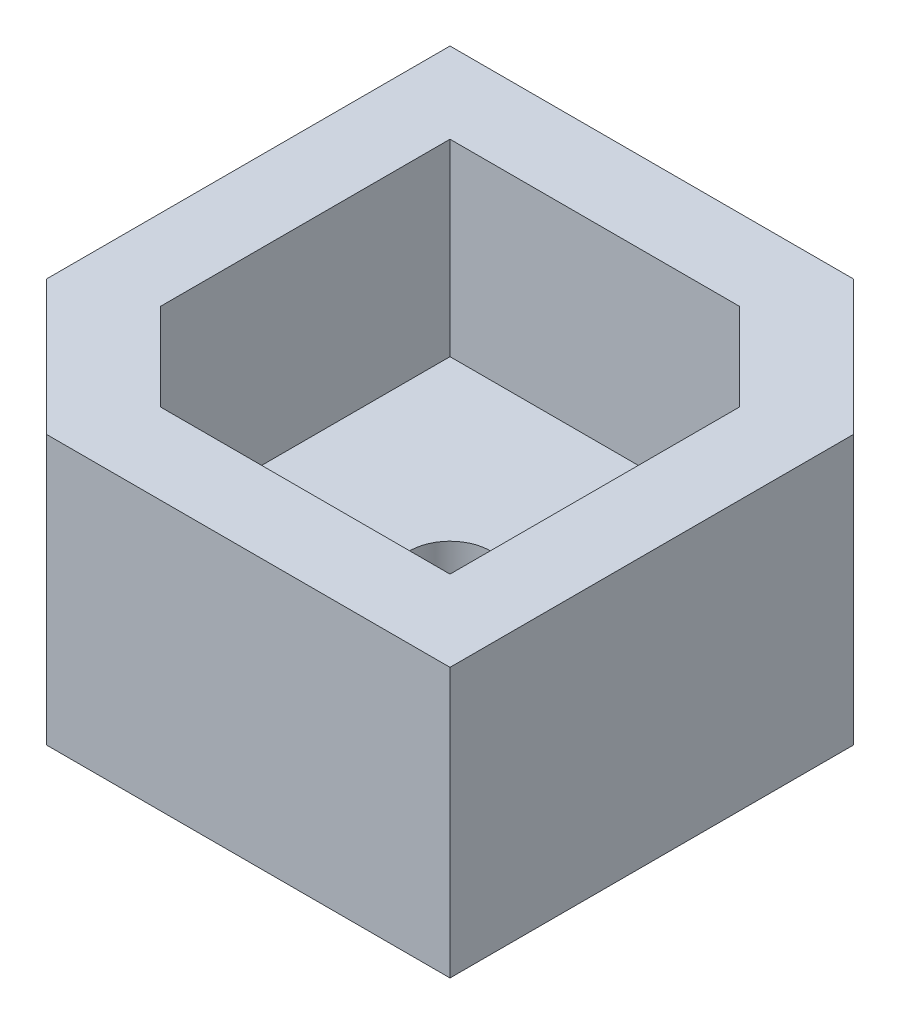
ISO-10303-21;
HEADER;
FILE_DESCRIPTION(('STEP AP214'),'2;1');
FILE_NAME('part.step','',(''),(''),'','','');
FILE_SCHEMA(('AUTOMOTIVE_DESIGN { 1 0 10303 214 1 1 1 1 }'));
ENDSEC;
DATA;
#1=APPLICATION_CONTEXT('core data for automotive mechanical design processes');
#2=APPLICATION_PROTOCOL_DEFINITION('international standard','automotive_design',2000,#1);
#3=PRODUCT_CONTEXT('',#1,'mechanical');
#4=PRODUCT('Part','Part','',(#3));
#5=PRODUCT_RELATED_PRODUCT_CATEGORY('part','',(#4));
#6=PRODUCT_DEFINITION_FORMATION('','',#4);
#7=PRODUCT_DEFINITION_CONTEXT('part definition',#1,'design');
#8=PRODUCT_DEFINITION('design','',#6,#7);
#9=PRODUCT_DEFINITION_SHAPE('','',#8);
#10=(LENGTH_UNIT() NAMED_UNIT(*) SI_UNIT(.MILLI.,.METRE.));
#11=(NAMED_UNIT(*) PLANE_ANGLE_UNIT() SI_UNIT($,.RADIAN.));
#12=(NAMED_UNIT(*) SI_UNIT($,.STERADIAN.) SOLID_ANGLE_UNIT());
#13=UNCERTAINTY_MEASURE_WITH_UNIT(LENGTH_MEASURE(1.E-05),#10,'distance_accuracy_value','');
#14=(GEOMETRIC_REPRESENTATION_CONTEXT(3) GLOBAL_UNCERTAINTY_ASSIGNED_CONTEXT((#13)) GLOBAL_UNIT_ASSIGNED_CONTEXT((#10,
#11,#12)) REPRESENTATION_CONTEXT('',''));
#15=CARTESIAN_POINT('',(0.,0.,0.));
#16=DIRECTION('',(0.,0.,1.));
#17=DIRECTION('',(1.,0.,0.));
#18=AXIS2_PLACEMENT_3D('',#15,#16,#17);
#19=CARTESIAN_POINT('',(0.,3.,0.));
#20=DIRECTION('',(0.,-1.,0.));
#21=DIRECTION('',(0.,0.,-1.));
#22=AXIS2_PLACEMENT_3D('',#19,#20,#21);
#23=PLANE('',#22);
#24=DIRECTION('',(-0.707106781186548,0.,-0.707106781186547));
#25=VECTOR('',#24,1.);
#26=CARTESIAN_POINT('',(7.,3.,-3.7573593128807));
#27=LINE('',#26,#25);
#28=CARTESIAN_POINT('',(7.,3.,-3.7573593128807));
#29=VERTEX_POINT('',#28);
#30=CARTESIAN_POINT('',(3.7573593128807,3.,-7.));
#31=VERTEX_POINT('',#30);
#32=EDGE_CURVE('E147',#29,#31,#27,.T.);
#33=ORIENTED_EDGE('',*,*,#32,.T.);
#34=DIRECTION('',(-1.,0.,0.));
#35=VECTOR('',#34,1.);
#36=CARTESIAN_POINT('',(3.7573593128807,3.,-7.));
#37=LINE('',#36,#35);
#38=CARTESIAN_POINT('',(-7.,3.,-7.));
#39=VERTEX_POINT('',#38);
#40=EDGE_CURVE('E177',#31,#39,#37,.T.);
#41=ORIENTED_EDGE('',*,*,#40,.T.);
#42=DIRECTION('',(0.,0.,1.));
#43=VECTOR('',#42,1.);
#44=CARTESIAN_POINT('',(-7.,3.,-7.));
#45=LINE('',#44,#43);
#46=CARTESIAN_POINT('',(-7.,3.,3.7573593128807));
#47=VERTEX_POINT('',#46);
#48=EDGE_CURVE('E153',#39,#47,#45,.T.);
#49=ORIENTED_EDGE('',*,*,#48,.T.);
#50=DIRECTION('',(0.707106781186548,0.,0.707106781186547));
#51=VECTOR('',#50,1.);
#52=CARTESIAN_POINT('',(-7.,3.,3.7573593128807));
#53=LINE('',#52,#51);
#54=CARTESIAN_POINT('',(-3.7573593128807,3.,7.));
#55=VERTEX_POINT('',#54);
#56=EDGE_CURVE('E182',#47,#55,#53,.T.);
#57=ORIENTED_EDGE('',*,*,#56,.T.);
#58=DIRECTION('',(1.,0.,0.));
#59=VECTOR('',#58,1.);
#60=CARTESIAN_POINT('',(-3.7573593128807,3.,7.));
#61=LINE('',#60,#59);
#62=CARTESIAN_POINT('',(7.,3.,7.));
#63=VERTEX_POINT('',#62);
#64=EDGE_CURVE('E186',#55,#63,#61,.T.);
#65=ORIENTED_EDGE('',*,*,#64,.T.);
#66=DIRECTION('',(0.,0.,-1.));
#67=VECTOR('',#66,1.);
#68=CARTESIAN_POINT('',(7.,3.,7.));
#69=LINE('',#68,#67);
#70=EDGE_CURVE('E190',#63,#29,#69,.T.);
#71=ORIENTED_EDGE('',*,*,#70,.T.);
#72=EDGE_LOOP('',(#33,#41,#49,#57,#65,#71));
#73=FACE_BOUND('',#72,.T.);
#74=CARTESIAN_POINT('',(0.,3.,0.));
#75=DIRECTION('',(0.,1.,0.));
#76=DIRECTION('',(0.,0.,1.));
#77=AXIS2_PLACEMENT_3D('',#74,#75,#76);
#78=CIRCLE('',#77,1.5);
#79=CARTESIAN_POINT('',(0.,3.,1.5));
#80=VERTEX_POINT('',#79);
#81=EDGE_CURVE('E234',#80,#80,#78,.T.);
#82=ORIENTED_EDGE('',*,*,#81,.F.);
#83=EDGE_LOOP('',(#82));
#84=FACE_BOUND('',#83,.T.);
#85=ADVANCED_FACE('F45',(#73,#84),#23,.F.);
#86=CARTESIAN_POINT('',(0.,0.,0.));
#87=DIRECTION('',(0.,-1.,0.));
#88=DIRECTION('',(0.,0.,-1.));
#89=AXIS2_PLACEMENT_3D('',#86,#87,#88);
#90=PLANE('',#89);
#91=DIRECTION('',(-1.,0.,0.));
#92=VECTOR('',#91,1.);
#93=CARTESIAN_POINT('',(-10.,0.,-10.));
#94=LINE('',#93,#92);
#95=CARTESIAN_POINT('',(5.,0.,-10.));
#96=VERTEX_POINT('',#95);
#97=CARTESIAN_POINT('',(-10.,0.,-10.));
#98=VERTEX_POINT('',#97);
#99=EDGE_CURVE('E245',#96,#98,#94,.T.);
#100=ORIENTED_EDGE('',*,*,#99,.F.);
#101=DIRECTION('',(-0.707106781186546,0.,-0.707106781186549));
#102=VECTOR('',#101,1.);
#103=CARTESIAN_POINT('',(7.50000000000001,0.,-7.49999999999998));
#104=LINE('',#103,#102);
#105=CARTESIAN_POINT('',(10.,0.,-4.99999999999998));
#106=VERTEX_POINT('',#105);
#107=EDGE_CURVE('E268',#96,#106,#104,.F.);
#108=ORIENTED_EDGE('',*,*,#107,.T.);
#109=DIRECTION('',(0.,0.,-1.));
#110=VECTOR('',#109,1.);
#111=CARTESIAN_POINT('',(10.,0.,10.));
#112=LINE('',#111,#110);
#113=CARTESIAN_POINT('',(10.,0.,10.));
#114=VERTEX_POINT('',#113);
#115=EDGE_CURVE('E238',#114,#106,#112,.T.);
#116=ORIENTED_EDGE('',*,*,#115,.F.);
#117=DIRECTION('',(1.,0.,0.));
#118=VECTOR('',#117,1.);
#119=CARTESIAN_POINT('',(-10.,0.,10.));
#120=LINE('',#119,#118);
#121=CARTESIAN_POINT('',(-5.,0.,10.));
#122=VERTEX_POINT('',#121);
#123=EDGE_CURVE('E251',#122,#114,#120,.T.);
#124=ORIENTED_EDGE('',*,*,#123,.F.);
#125=DIRECTION('',(0.707106781186546,0.,0.707106781186549));
#126=VECTOR('',#125,1.);
#127=CARTESIAN_POINT('',(-7.50000000000001,0.,7.49999999999998));
#128=LINE('',#127,#126);
#129=CARTESIAN_POINT('',(-10.,0.,4.99999999999998));
#130=VERTEX_POINT('',#129);
#131=EDGE_CURVE('E70',#122,#130,#128,.F.);
#132=ORIENTED_EDGE('',*,*,#131,.T.);
#133=DIRECTION('',(0.,0.,1.));
#134=VECTOR('',#133,1.);
#135=CARTESIAN_POINT('',(-10.,0.,10.));
#136=LINE('',#135,#134);
#137=EDGE_CURVE('E248',#98,#130,#136,.T.);
#138=ORIENTED_EDGE('',*,*,#137,.F.);
#139=EDGE_LOOP('',(#100,#108,#116,#124,#132,#138));
#140=FACE_BOUND('',#139,.T.);
#141=CARTESIAN_POINT('',(0.,0.,0.));
#142=DIRECTION('',(0.,1.,0.));
#143=DIRECTION('',(0.,0.,1.));
#144=AXIS2_PLACEMENT_3D('',#141,#142,#143);
#145=CIRCLE('',#144,1.5);
#146=CARTESIAN_POINT('',(0.,0.,1.5));
#147=VERTEX_POINT('',#146);
#148=EDGE_CURVE('E233',#147,#147,#145,.T.);
#149=ORIENTED_EDGE('',*,*,#148,.T.);
#150=EDGE_LOOP('',(#149));
#151=FACE_BOUND('',#150,.T.);
#152=ADVANCED_FACE('F282',(#140,#151),#90,.T.);
#153=CARTESIAN_POINT('',(10.,3.,10.));
#154=DIRECTION('',(-1.,0.,0.));
#155=DIRECTION('',(0.,0.,1.));
#156=AXIS2_PLACEMENT_3D('',#153,#154,#155);
#157=PLANE('',#156);
#158=ORIENTED_EDGE('',*,*,#115,.T.);
#159=DIRECTION('',(0.,1.,0.));
#160=VECTOR('',#159,1.);
#161=CARTESIAN_POINT('',(10.,3.,-4.99999999999998));
#162=LINE('',#161,#160);
#163=CARTESIAN_POINT('',(10.,10.,-4.99999999999998));
#164=VERTEX_POINT('',#163);
#165=EDGE_CURVE('E271',#106,#164,#162,.T.);
#166=ORIENTED_EDGE('',*,*,#165,.T.);
#167=DIRECTION('',(0.,0.,-1.));
#168=VECTOR('',#167,1.);
#169=CARTESIAN_POINT('',(10.,10.,10.));
#170=LINE('',#169,#168);
#171=CARTESIAN_POINT('',(10.,10.,10.));
#172=VERTEX_POINT('',#171);
#173=EDGE_CURVE('E213',#172,#164,#170,.T.);
#174=ORIENTED_EDGE('',*,*,#173,.F.);
#175=DIRECTION('',(0.,-1.,0.));
#176=VECTOR('',#175,1.);
#177=CARTESIAN_POINT('',(10.,3.,10.));
#178=LINE('',#177,#176);
#179=EDGE_CURVE('E254',#172,#114,#178,.T.);
#180=ORIENTED_EDGE('',*,*,#179,.T.);
#181=EDGE_LOOP('',(#158,#166,#174,#180));
#182=FACE_BOUND('',#181,.T.);
#183=ADVANCED_FACE('F286',(#182),#157,.F.);
#184=CARTESIAN_POINT('',(-10.,3.,-10.));
#185=DIRECTION('',(0.,0.,1.));
#186=DIRECTION('',(1.,0.,0.));
#187=AXIS2_PLACEMENT_3D('',#184,#185,#186);
#188=PLANE('',#187);
#189=DIRECTION('',(0.,-1.,0.));
#190=VECTOR('',#189,1.);
#191=CARTESIAN_POINT('',(-10.,3.,-10.));
#192=LINE('',#191,#190);
#193=CARTESIAN_POINT('',(-10.,10.,-10.));
#194=VERTEX_POINT('',#193);
#195=EDGE_CURVE('E258',#194,#98,#192,.T.);
#196=ORIENTED_EDGE('',*,*,#195,.F.);
#197=DIRECTION('',(-1.,0.,0.));
#198=VECTOR('',#197,1.);
#199=CARTESIAN_POINT('',(5.,10.,-10.));
#200=LINE('',#199,#198);
#201=CARTESIAN_POINT('',(5.,10.,-10.));
#202=VERTEX_POINT('',#201);
#203=EDGE_CURVE('E221',#202,#194,#200,.T.);
#204=ORIENTED_EDGE('',*,*,#203,.F.);
#205=DIRECTION('',(0.,-1.,0.));
#206=VECTOR('',#205,1.);
#207=CARTESIAN_POINT('',(5.,3.,-10.));
#208=LINE('',#207,#206);
#209=EDGE_CURVE('E262',#202,#96,#208,.T.);
#210=ORIENTED_EDGE('',*,*,#209,.T.);
#211=ORIENTED_EDGE('',*,*,#99,.T.);
#212=EDGE_LOOP('',(#196,#204,#210,#211));
#213=FACE_BOUND('',#212,.T.);
#214=ADVANCED_FACE('F295',(#213),#188,.F.);
#215=CARTESIAN_POINT('',(-10.,3.,10.));
#216=DIRECTION('',(1.,0.,0.));
#217=DIRECTION('',(0.,0.,-1.));
#218=AXIS2_PLACEMENT_3D('',#215,#216,#217);
#219=PLANE('',#218);
#220=ORIENTED_EDGE('',*,*,#137,.T.);
#221=DIRECTION('',(0.,1.,0.));
#222=VECTOR('',#221,1.);
#223=CARTESIAN_POINT('',(-10.,3.,4.99999999999998));
#224=LINE('',#223,#222);
#225=CARTESIAN_POINT('',(-10.,10.,4.99999999999998));
#226=VERTEX_POINT('',#225);
#227=EDGE_CURVE('E11',#130,#226,#224,.T.);
#228=ORIENTED_EDGE('',*,*,#227,.T.);
#229=DIRECTION('',(0.,0.,1.));
#230=VECTOR('',#229,1.);
#231=CARTESIAN_POINT('',(-10.,10.,-10.));
#232=LINE('',#231,#230);
#233=EDGE_CURVE('E225',#194,#226,#232,.T.);
#234=ORIENTED_EDGE('',*,*,#233,.F.);
#235=ORIENTED_EDGE('',*,*,#195,.T.);
#236=EDGE_LOOP('',(#220,#228,#234,#235));
#237=FACE_BOUND('',#236,.T.);
#238=ADVANCED_FACE('F297',(#237),#219,.F.);
#239=CARTESIAN_POINT('',(-10.,3.,10.));
#240=DIRECTION('',(0.,0.,-1.));
#241=DIRECTION('',(-1.,0.,0.));
#242=AXIS2_PLACEMENT_3D('',#239,#240,#241);
#243=PLANE('',#242);
#244=ORIENTED_EDGE('',*,*,#179,.F.);
#245=DIRECTION('',(1.,0.,0.));
#246=VECTOR('',#245,1.);
#247=CARTESIAN_POINT('',(-5.,10.,10.));
#248=LINE('',#247,#246);
#249=CARTESIAN_POINT('',(-5.,10.,10.));
#250=VERTEX_POINT('',#249);
#251=EDGE_CURVE('E155',#250,#172,#248,.T.);
#252=ORIENTED_EDGE('',*,*,#251,.F.);
#253=DIRECTION('',(0.,-1.,0.));
#254=VECTOR('',#253,1.);
#255=CARTESIAN_POINT('',(-5.,3.,10.));
#256=LINE('',#255,#254);
#257=EDGE_CURVE('E55',#250,#122,#256,.T.);
#258=ORIENTED_EDGE('',*,*,#257,.T.);
#259=ORIENTED_EDGE('',*,*,#123,.T.);
#260=EDGE_LOOP('',(#244,#252,#258,#259));
#261=FACE_BOUND('',#260,.T.);
#262=ADVANCED_FACE('F277',(#261),#243,.F.);
#263=CARTESIAN_POINT('',(0.,3.,0.));
#264=DIRECTION('',(0.,-1.,0.));
#265=DIRECTION('',(0.,0.,-1.));
#266=AXIS2_PLACEMENT_3D('',#263,#264,#265);
#267=CYLINDRICAL_SURFACE('',#266,1.5);
#268=ORIENTED_EDGE('',*,*,#81,.T.);
#269=EDGE_LOOP('',(#268));
#270=FACE_BOUND('',#269,.T.);
#271=ORIENTED_EDGE('',*,*,#148,.F.);
#272=EDGE_LOOP('',(#271));
#273=FACE_BOUND('',#272,.T.);
#274=ADVANCED_FACE('F305',(#270,#273),#267,.F.);
#275=CARTESIAN_POINT('',(5.,3.,-10.));
#276=DIRECTION('',(-0.707106781186549,0.,0.707106781186546));
#277=DIRECTION('',(0.,-1.,0.));
#278=AXIS2_PLACEMENT_3D('',#275,#276,#277);
#279=PLANE('',#278);
#280=ORIENTED_EDGE('',*,*,#209,.F.);
#281=DIRECTION('',(-0.707106781186546,0.,-0.707106781186549));
#282=VECTOR('',#281,1.);
#283=CARTESIAN_POINT('',(10.,10.,-4.99999999999998));
#284=LINE('',#283,#282);
#285=EDGE_CURVE('E217',#164,#202,#284,.T.);
#286=ORIENTED_EDGE('',*,*,#285,.F.);
#287=ORIENTED_EDGE('',*,*,#165,.F.);
#288=ORIENTED_EDGE('',*,*,#107,.F.);
#289=EDGE_LOOP('',(#280,#286,#287,#288));
#290=FACE_BOUND('',#289,.T.);
#291=ADVANCED_FACE('F290',(#290),#279,.F.);
#292=CARTESIAN_POINT('',(-5.,3.,10.));
#293=DIRECTION('',(0.707106781186549,0.,-0.707106781186546));
#294=DIRECTION('',(0.,-1.,0.));
#295=AXIS2_PLACEMENT_3D('',#292,#293,#294);
#296=PLANE('',#295);
#297=ORIENTED_EDGE('',*,*,#257,.F.);
#298=DIRECTION('',(0.707106781186546,0.,0.707106781186549));
#299=VECTOR('',#298,1.);
#300=CARTESIAN_POINT('',(-10.,10.,4.99999999999998));
#301=LINE('',#300,#299);
#302=EDGE_CURVE('E229',#226,#250,#301,.T.);
#303=ORIENTED_EDGE('',*,*,#302,.F.);
#304=ORIENTED_EDGE('',*,*,#227,.F.);
#305=ORIENTED_EDGE('',*,*,#131,.F.);
#306=EDGE_LOOP('',(#297,#303,#304,#305));
#307=FACE_BOUND('',#306,.T.);
#308=ADVANCED_FACE('F48',(#307),#296,.F.);
#309=CARTESIAN_POINT('',(0.,10.,0.));
#310=DIRECTION('',(0.,1.,0.));
#311=DIRECTION('',(0.,0.,1.));
#312=AXIS2_PLACEMENT_3D('',#309,#310,#311);
#313=PLANE('',#312);
#314=ORIENTED_EDGE('',*,*,#251,.T.);
#315=ORIENTED_EDGE('',*,*,#173,.T.);
#316=ORIENTED_EDGE('',*,*,#285,.T.);
#317=ORIENTED_EDGE('',*,*,#203,.T.);
#318=ORIENTED_EDGE('',*,*,#233,.T.);
#319=ORIENTED_EDGE('',*,*,#302,.T.);
#320=EDGE_LOOP('',(#314,#315,#316,#317,#318,#319));
#321=FACE_BOUND('',#320,.T.);
#322=DIRECTION('',(0.,0.,1.));
#323=VECTOR('',#322,1.);
#324=CARTESIAN_POINT('',(-7.,10.,-7.));
#325=LINE('',#324,#323);
#326=CARTESIAN_POINT('',(-7.,10.,-7.));
#327=VERTEX_POINT('',#326);
#328=CARTESIAN_POINT('',(-7.,10.,3.7573593128807));
#329=VERTEX_POINT('',#328);
#330=EDGE_CURVE('E146',#327,#329,#325,.T.);
#331=ORIENTED_EDGE('',*,*,#330,.F.);
#332=DIRECTION('',(-1.,0.,0.));
#333=VECTOR('',#332,1.);
#334=CARTESIAN_POINT('',(3.7573593128807,10.,-7.));
#335=LINE('',#334,#333);
#336=CARTESIAN_POINT('',(3.7573593128807,10.,-7.));
#337=VERTEX_POINT('',#336);
#338=EDGE_CURVE('E137',#337,#327,#335,.T.);
#339=ORIENTED_EDGE('',*,*,#338,.F.);
#340=DIRECTION('',(-0.707106781186548,0.,-0.707106781186547));
#341=VECTOR('',#340,1.);
#342=CARTESIAN_POINT('',(7.,10.,-3.7573593128807));
#343=LINE('',#342,#341);
#344=CARTESIAN_POINT('',(7.,10.,-3.7573593128807));
#345=VERTEX_POINT('',#344);
#346=EDGE_CURVE('E174',#345,#337,#343,.T.);
#347=ORIENTED_EDGE('',*,*,#346,.F.);
#348=DIRECTION('',(0.,0.,-1.));
#349=VECTOR('',#348,1.);
#350=CARTESIAN_POINT('',(7.,10.,7.));
#351=LINE('',#350,#349);
#352=CARTESIAN_POINT('',(7.,10.,7.));
#353=VERTEX_POINT('',#352);
#354=EDGE_CURVE('E170',#353,#345,#351,.T.);
#355=ORIENTED_EDGE('',*,*,#354,.F.);
#356=DIRECTION('',(1.,0.,0.));
#357=VECTOR('',#356,1.);
#358=CARTESIAN_POINT('',(-3.7573593128807,10.,7.));
#359=LINE('',#358,#357);
#360=CARTESIAN_POINT('',(-3.7573593128807,10.,7.));
#361=VERTEX_POINT('',#360);
#362=EDGE_CURVE('E165',#361,#353,#359,.T.);
#363=ORIENTED_EDGE('',*,*,#362,.F.);
#364=DIRECTION('',(0.707106781186548,0.,0.707106781186547));
#365=VECTOR('',#364,1.);
#366=CARTESIAN_POINT('',(-7.,10.,3.7573593128807));
#367=LINE('',#366,#365);
#368=EDGE_CURVE('E161',#329,#361,#367,.T.);
#369=ORIENTED_EDGE('',*,*,#368,.F.);
#370=EDGE_LOOP('',(#331,#339,#347,#355,#363,#369));
#371=FACE_BOUND('',#370,.T.);
#372=ADVANCED_FACE('F159',(#321,#371),#313,.T.);
#373=CARTESIAN_POINT('',(3.7573593128807,10.,-7.));
#374=DIRECTION('',(0.,0.,1.));
#375=DIRECTION('',(1.,0.,0.));
#376=AXIS2_PLACEMENT_3D('',#373,#374,#375);
#377=PLANE('',#376);
#378=ORIENTED_EDGE('',*,*,#40,.F.);
#379=DIRECTION('',(0.,-1.,0.));
#380=VECTOR('',#379,1.);
#381=CARTESIAN_POINT('',(3.7573593128807,10.,-7.));
#382=LINE('',#381,#380);
#383=EDGE_CURVE('E62',#337,#31,#382,.T.);
#384=ORIENTED_EDGE('',*,*,#383,.F.);
#385=ORIENTED_EDGE('',*,*,#338,.T.);
#386=DIRECTION('',(0.,-1.,0.));
#387=VECTOR('',#386,1.);
#388=CARTESIAN_POINT('',(-7.,10.,-7.));
#389=LINE('',#388,#387);
#390=EDGE_CURVE('E140',#327,#39,#389,.T.);
#391=ORIENTED_EDGE('',*,*,#390,.T.);
#392=EDGE_LOOP('',(#378,#384,#385,#391));
#393=FACE_BOUND('',#392,.T.);
#394=ADVANCED_FACE('F139',(#393),#377,.T.);
#395=CARTESIAN_POINT('',(-7.,10.,-7.));
#396=DIRECTION('',(1.,0.,0.));
#397=DIRECTION('',(0.,0.,-1.));
#398=AXIS2_PLACEMENT_3D('',#395,#396,#397);
#399=PLANE('',#398);
#400=ORIENTED_EDGE('',*,*,#48,.F.);
#401=ORIENTED_EDGE('',*,*,#390,.F.);
#402=ORIENTED_EDGE('',*,*,#330,.T.);
#403=DIRECTION('',(0.,-1.,0.));
#404=VECTOR('',#403,1.);
#405=CARTESIAN_POINT('',(-7.,10.,3.7573593128807));
#406=LINE('',#405,#404);
#407=EDGE_CURVE('E156',#329,#47,#406,.T.);
#408=ORIENTED_EDGE('',*,*,#407,.T.);
#409=EDGE_LOOP('',(#400,#401,#402,#408));
#410=FACE_BOUND('',#409,.T.);
#411=ADVANCED_FACE('F150',(#410),#399,.T.);
#412=CARTESIAN_POINT('',(-7.,10.,3.7573593128807));
#413=DIRECTION('',(0.707106781186548,0.,-0.707106781186548));
#414=DIRECTION('',(-0.707106781186548,0.,-0.707106781186547));
#415=AXIS2_PLACEMENT_3D('',#412,#413,#414);
#416=PLANE('',#415);
#417=ORIENTED_EDGE('',*,*,#56,.F.);
#418=ORIENTED_EDGE('',*,*,#407,.F.);
#419=ORIENTED_EDGE('',*,*,#368,.T.);
#420=DIRECTION('',(0.,-1.,0.));
#421=VECTOR('',#420,1.);
#422=CARTESIAN_POINT('',(-3.7573593128807,10.,7.));
#423=LINE('',#422,#421);
#424=EDGE_CURVE('E205',#361,#55,#423,.T.);
#425=ORIENTED_EDGE('',*,*,#424,.T.);
#426=EDGE_LOOP('',(#417,#418,#419,#425));
#427=FACE_BOUND('',#426,.T.);
#428=ADVANCED_FACE('F385',(#427),#416,.T.);
#429=CARTESIAN_POINT('',(-3.7573593128807,10.,7.));
#430=DIRECTION('',(0.,0.,-1.));
#431=DIRECTION('',(-1.,0.,0.));
#432=AXIS2_PLACEMENT_3D('',#429,#430,#431);
#433=PLANE('',#432);
#434=ORIENTED_EDGE('',*,*,#64,.F.);
#435=ORIENTED_EDGE('',*,*,#424,.F.);
#436=ORIENTED_EDGE('',*,*,#362,.T.);
#437=DIRECTION('',(0.,-1.,0.));
#438=VECTOR('',#437,1.);
#439=CARTESIAN_POINT('',(7.,10.,7.));
#440=LINE('',#439,#438);
#441=EDGE_CURVE('E202',#353,#63,#440,.T.);
#442=ORIENTED_EDGE('',*,*,#441,.T.);
#443=EDGE_LOOP('',(#434,#435,#436,#442));
#444=FACE_BOUND('',#443,.T.);
#445=ADVANCED_FACE('F395',(#444),#433,.T.);
#446=CARTESIAN_POINT('',(7.,10.,7.));
#447=DIRECTION('',(-1.,0.,0.));
#448=DIRECTION('',(0.,0.,1.));
#449=AXIS2_PLACEMENT_3D('',#446,#447,#448);
#450=PLANE('',#449);
#451=ORIENTED_EDGE('',*,*,#70,.F.);
#452=ORIENTED_EDGE('',*,*,#441,.F.);
#453=ORIENTED_EDGE('',*,*,#354,.T.);
#454=DIRECTION('',(0.,-1.,0.));
#455=VECTOR('',#454,1.);
#456=CARTESIAN_POINT('',(7.,10.,-3.7573593128807));
#457=LINE('',#456,#455);
#458=EDGE_CURVE('E199',#345,#29,#457,.T.);
#459=ORIENTED_EDGE('',*,*,#458,.T.);
#460=EDGE_LOOP('',(#451,#452,#453,#459));
#461=FACE_BOUND('',#460,.T.);
#462=ADVANCED_FACE('F406',(#461),#450,.T.);
#463=CARTESIAN_POINT('',(7.,10.,-3.7573593128807));
#464=DIRECTION('',(-0.707106781186548,0.,0.707106781186548));
#465=DIRECTION('',(0.707106781186548,0.,0.707106781186547));
#466=AXIS2_PLACEMENT_3D('',#463,#464,#465);
#467=PLANE('',#466);
#468=ORIENTED_EDGE('',*,*,#32,.F.);
#469=ORIENTED_EDGE('',*,*,#458,.F.);
#470=ORIENTED_EDGE('',*,*,#346,.T.);
#471=ORIENTED_EDGE('',*,*,#383,.T.);
#472=EDGE_LOOP('',(#468,#469,#470,#471));
#473=FACE_BOUND('',#472,.T.);
#474=ADVANCED_FACE('F417',(#473),#467,.T.);
#475=CLOSED_SHELL('',(#85,#152,#183,#214,#238,#262,#274,#291,#308,#372,#394,#411,#428,#445,#462,#474));
#476=MANIFOLD_SOLID_BREP('B2',#475);
#477=ADVANCED_BREP_SHAPE_REPRESENTATION('',(#18,#476),#14);
#478=SHAPE_DEFINITION_REPRESENTATION(#9,#477);
ENDSEC;
END-ISO-10303-21;
